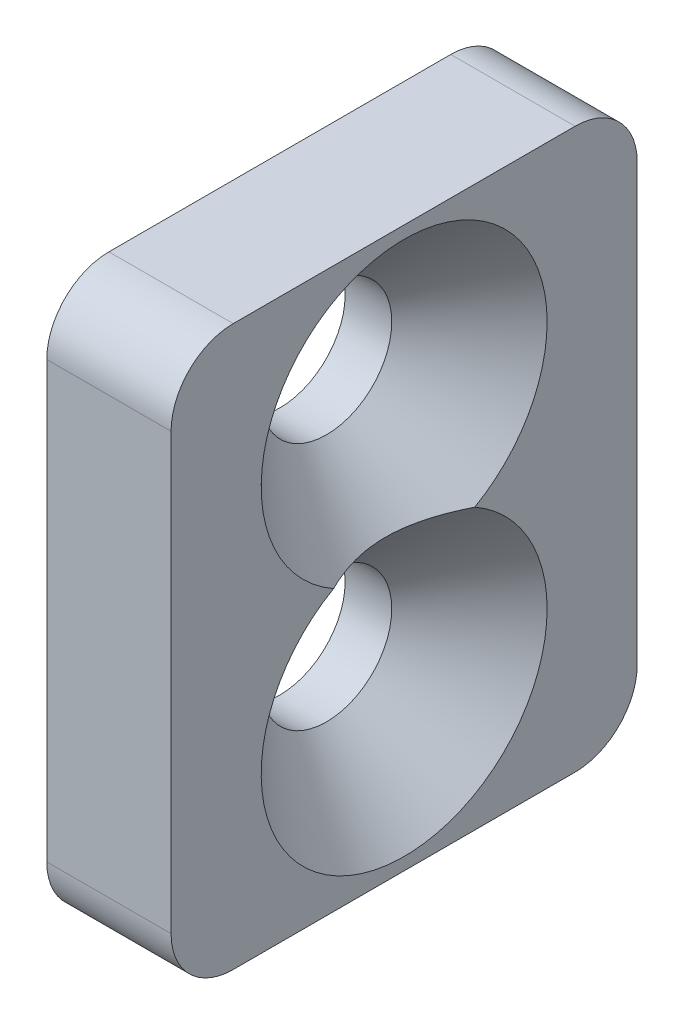
ISO-10303-21;
HEADER;
FILE_DESCRIPTION(('STEP AP214'),'2;1');
FILE_NAME('part.step','',(''),(''),'','','');
FILE_SCHEMA(('AUTOMOTIVE_DESIGN { 1 0 10303 214 1 1 1 1 }'));
ENDSEC;
DATA;
#1=APPLICATION_CONTEXT('core data for automotive mechanical design processes');
#2=APPLICATION_PROTOCOL_DEFINITION('international standard','automotive_design',2000,#1);
#3=PRODUCT_CONTEXT('',#1,'mechanical');
#4=PRODUCT('Part','Part','',(#3));
#5=PRODUCT_RELATED_PRODUCT_CATEGORY('part','',(#4));
#6=PRODUCT_DEFINITION_FORMATION('','',#4);
#7=PRODUCT_DEFINITION_CONTEXT('part definition',#1,'design');
#8=PRODUCT_DEFINITION('design','',#6,#7);
#9=PRODUCT_DEFINITION_SHAPE('','',#8);
#10=(LENGTH_UNIT() NAMED_UNIT(*) SI_UNIT(.MILLI.,.METRE.));
#11=(NAMED_UNIT(*) PLANE_ANGLE_UNIT() SI_UNIT($,.RADIAN.));
#12=(NAMED_UNIT(*) SI_UNIT($,.STERADIAN.) SOLID_ANGLE_UNIT());
#13=UNCERTAINTY_MEASURE_WITH_UNIT(LENGTH_MEASURE(1.E-05),#10,'distance_accuracy_value','');
#14=(GEOMETRIC_REPRESENTATION_CONTEXT(3) GLOBAL_UNCERTAINTY_ASSIGNED_CONTEXT((#13)) GLOBAL_UNIT_ASSIGNED_CONTEXT((#10,
#11,#12)) REPRESENTATION_CONTEXT('',''));
#15=CARTESIAN_POINT('',(0.,0.,0.));
#16=DIRECTION('',(0.,0.,1.));
#17=DIRECTION('',(1.,0.,0.));
#18=AXIS2_PLACEMENT_3D('',#15,#16,#17);
#19=CARTESIAN_POINT('',(4.,0.,0.));
#20=DIRECTION('',(-1.,0.,0.));
#21=DIRECTION('',(0.,0.,1.));
#22=AXIS2_PLACEMENT_3D('',#19,#20,#21);
#23=PLANE('',#22);
#24=CARTESIAN_POINT('',(4.,4.,0.));
#25=DIRECTION('',(-1.,0.,0.));
#26=DIRECTION('',(0.,0.,1.));
#27=AXIS2_PLACEMENT_3D('',#24,#25,#26);
#28=CIRCLE('',#27,4.60000000000001);
#29=CARTESIAN_POINT('',(4.,4.,-4.60000000000001));
#30=VERTEX_POINT('',#29);
#31=CARTESIAN_POINT('',(4.,0.,-2.27156333832013));
#32=VERTEX_POINT('',#31);
#33=EDGE_CURVE('E190',#30,#32,#28,.T.);
#34=ORIENTED_EDGE('',*,*,#33,.T.);
#35=CARTESIAN_POINT('',(4.,-4.,0.));
#36=DIRECTION('',(-1.,0.,0.));
#37=DIRECTION('',(0.,0.,1.));
#38=AXIS2_PLACEMENT_3D('',#35,#36,#37);
#39=CIRCLE('',#38,4.60000000000001);
#40=CARTESIAN_POINT('',(4.,-4.,-4.60000000000001));
#41=VERTEX_POINT('',#40);
#42=EDGE_CURVE('E49',#32,#41,#39,.T.);
#43=ORIENTED_EDGE('',*,*,#42,.T.);
#44=CARTESIAN_POINT('',(4.,-4.,0.));
#45=DIRECTION('',(-1.,0.,0.));
#46=DIRECTION('',(0.,0.,1.));
#47=AXIS2_PLACEMENT_3D('',#44,#45,#46);
#48=CIRCLE('',#47,4.60000000000001);
#49=CARTESIAN_POINT('',(4.,0.,2.27156333832013));
#50=VERTEX_POINT('',#49);
#51=EDGE_CURVE('E56',#41,#50,#48,.T.);
#52=ORIENTED_EDGE('',*,*,#51,.T.);
#53=CARTESIAN_POINT('',(4.,4.,0.));
#54=DIRECTION('',(-1.,0.,0.));
#55=DIRECTION('',(0.,0.,1.));
#56=AXIS2_PLACEMENT_3D('',#53,#54,#55);
#57=CIRCLE('',#56,4.60000000000001);
#58=EDGE_CURVE('E192',#50,#30,#57,.T.);
#59=ORIENTED_EDGE('',*,*,#58,.T.);
#60=EDGE_LOOP('',(#34,#43,#52,#59));
#61=FACE_BOUND('',#60,.T.);
#62=DIRECTION('',(0.,0.,-1.));
#63=VECTOR('',#62,1.);
#64=CARTESIAN_POINT('',(4.,-9.,7.5));
#65=LINE('',#64,#63);
#66=CARTESIAN_POINT('',(4.,-9.,5.5));
#67=VERTEX_POINT('',#66);
#68=CARTESIAN_POINT('',(4.,-9.,-5.5));
#69=VERTEX_POINT('',#68);
#70=EDGE_CURVE('E155',#67,#69,#65,.T.);
#71=ORIENTED_EDGE('',*,*,#70,.T.);
#72=CARTESIAN_POINT('',(4.,-7.,-5.5));
#73=DIRECTION('',(-1.,0.,0.));
#74=DIRECTION('',(0.,0.,1.));
#75=AXIS2_PLACEMENT_3D('',#72,#73,#74);
#76=CIRCLE('',#75,2.);
#77=CARTESIAN_POINT('',(4.,-7.,-7.5));
#78=VERTEX_POINT('',#77);
#79=EDGE_CURVE('E175',#69,#78,#76,.F.);
#80=ORIENTED_EDGE('',*,*,#79,.T.);
#81=DIRECTION('',(0.,1.,0.));
#82=VECTOR('',#81,1.);
#83=CARTESIAN_POINT('',(4.,-9.,-7.5));
#84=LINE('',#83,#82);
#85=CARTESIAN_POINT('',(4.,7.,-7.5));
#86=VERTEX_POINT('',#85);
#87=EDGE_CURVE('E137',#78,#86,#84,.T.);
#88=ORIENTED_EDGE('',*,*,#87,.T.);
#89=CARTESIAN_POINT('',(4.,7.,-5.5));
#90=DIRECTION('',(-1.,0.,0.));
#91=DIRECTION('',(0.,0.,1.));
#92=AXIS2_PLACEMENT_3D('',#89,#90,#91);
#93=CIRCLE('',#92,2.);
#94=CARTESIAN_POINT('',(4.,9.,-5.5));
#95=VERTEX_POINT('',#94);
#96=EDGE_CURVE('E171',#86,#95,#93,.F.);
#97=ORIENTED_EDGE('',*,*,#96,.T.);
#98=DIRECTION('',(0.,0.,1.));
#99=VECTOR('',#98,1.);
#100=CARTESIAN_POINT('',(4.,9.,7.5));
#101=LINE('',#100,#99);
#102=CARTESIAN_POINT('',(4.,9.,5.5));
#103=VERTEX_POINT('',#102);
#104=EDGE_CURVE('E205',#95,#103,#101,.T.);
#105=ORIENTED_EDGE('',*,*,#104,.T.);
#106=CARTESIAN_POINT('',(4.,7.,5.5));
#107=DIRECTION('',(-1.,0.,0.));
#108=DIRECTION('',(0.,0.,1.));
#109=AXIS2_PLACEMENT_3D('',#106,#107,#108);
#110=CIRCLE('',#109,2.);
#111=CARTESIAN_POINT('',(4.,7.,7.5));
#112=VERTEX_POINT('',#111);
#113=EDGE_CURVE('E169',#103,#112,#110,.F.);
#114=ORIENTED_EDGE('',*,*,#113,.T.);
#115=DIRECTION('',(0.,-1.,0.));
#116=VECTOR('',#115,1.);
#117=CARTESIAN_POINT('',(4.,-9.,7.5));
#118=LINE('',#117,#116);
#119=CARTESIAN_POINT('',(4.,-7.,7.5));
#120=VERTEX_POINT('',#119);
#121=EDGE_CURVE('E207',#112,#120,#118,.T.);
#122=ORIENTED_EDGE('',*,*,#121,.T.);
#123=CARTESIAN_POINT('',(4.,-7.,5.5));
#124=DIRECTION('',(-1.,0.,0.));
#125=DIRECTION('',(0.,0.,1.));
#126=AXIS2_PLACEMENT_3D('',#123,#124,#125);
#127=CIRCLE('',#126,2.);
#128=EDGE_CURVE('E173',#120,#67,#127,.F.);
#129=ORIENTED_EDGE('',*,*,#128,.T.);
#130=EDGE_LOOP('',(#71,#80,#88,#97,#105,#114,#122,#129));
#131=FACE_BOUND('',#130,.T.);
#132=ADVANCED_FACE('F34',(#61,#131),#23,.F.);
#133=CARTESIAN_POINT('',(0.,0.,0.));
#134=DIRECTION('',(-1.,0.,0.));
#135=DIRECTION('',(0.,0.,1.));
#136=AXIS2_PLACEMENT_3D('',#133,#134,#135);
#137=PLANE('',#136);
#138=CARTESIAN_POINT('',(0.,4.,0.));
#139=DIRECTION('',(1.,0.,0.));
#140=DIRECTION('',(0.,0.,-1.));
#141=AXIS2_PLACEMENT_3D('',#138,#139,#140);
#142=CIRCLE('',#141,2.1);
#143=CARTESIAN_POINT('',(0.,4.,-2.1));
#144=VERTEX_POINT('',#143);
#145=EDGE_CURVE('E146',#144,#144,#142,.T.);
#146=ORIENTED_EDGE('',*,*,#145,.T.);
#147=EDGE_LOOP('',(#146));
#148=FACE_BOUND('',#147,.T.);
#149=DIRECTION('',(0.,1.,0.));
#150=VECTOR('',#149,1.);
#151=CARTESIAN_POINT('',(0.,-9.,-7.5));
#152=LINE('',#151,#150);
#153=CARTESIAN_POINT('',(0.,-7.,-7.5));
#154=VERTEX_POINT('',#153);
#155=CARTESIAN_POINT('',(0.,7.,-7.5));
#156=VERTEX_POINT('',#155);
#157=EDGE_CURVE('E134',#154,#156,#152,.T.);
#158=ORIENTED_EDGE('',*,*,#157,.F.);
#159=CARTESIAN_POINT('',(0.,-7.,-5.5));
#160=DIRECTION('',(-1.,0.,0.));
#161=DIRECTION('',(0.,0.,1.));
#162=AXIS2_PLACEMENT_3D('',#159,#160,#161);
#163=CIRCLE('',#162,2.);
#164=CARTESIAN_POINT('',(0.,-9.,-5.5));
#165=VERTEX_POINT('',#164);
#166=EDGE_CURVE('E117',#154,#165,#163,.T.);
#167=ORIENTED_EDGE('',*,*,#166,.T.);
#168=DIRECTION('',(0.,0.,-1.));
#169=VECTOR('',#168,1.);
#170=CARTESIAN_POINT('',(0.,-9.,7.5));
#171=LINE('',#170,#169);
#172=CARTESIAN_POINT('',(0.,-9.,5.5));
#173=VERTEX_POINT('',#172);
#174=EDGE_CURVE('E160',#173,#165,#171,.T.);
#175=ORIENTED_EDGE('',*,*,#174,.F.);
#176=CARTESIAN_POINT('',(0.,-7.,5.5));
#177=DIRECTION('',(-1.,0.,0.));
#178=DIRECTION('',(0.,0.,1.));
#179=AXIS2_PLACEMENT_3D('',#176,#177,#178);
#180=CIRCLE('',#179,2.);
#181=CARTESIAN_POINT('',(0.,-7.,7.5));
#182=VERTEX_POINT('',#181);
#183=EDGE_CURVE('E128',#173,#182,#180,.T.);
#184=ORIENTED_EDGE('',*,*,#183,.T.);
#185=DIRECTION('',(0.,-1.,0.));
#186=VECTOR('',#185,1.);
#187=CARTESIAN_POINT('',(0.,-9.,7.5));
#188=LINE('',#187,#186);
#189=CARTESIAN_POINT('',(0.,7.,7.5));
#190=VERTEX_POINT('',#189);
#191=EDGE_CURVE('E149',#190,#182,#188,.T.);
#192=ORIENTED_EDGE('',*,*,#191,.F.);
#193=CARTESIAN_POINT('',(0.,7.,5.5));
#194=DIRECTION('',(-1.,0.,0.));
#195=DIRECTION('',(0.,0.,1.));
#196=AXIS2_PLACEMENT_3D('',#193,#194,#195);
#197=CIRCLE('',#196,2.);
#198=CARTESIAN_POINT('',(0.,9.,5.5));
#199=VERTEX_POINT('',#198);
#200=EDGE_CURVE('E138',#190,#199,#197,.T.);
#201=ORIENTED_EDGE('',*,*,#200,.T.);
#202=DIRECTION('',(0.,0.,1.));
#203=VECTOR('',#202,1.);
#204=CARTESIAN_POINT('',(0.,9.,7.5));
#205=LINE('',#204,#203);
#206=CARTESIAN_POINT('',(0.,9.,-5.5));
#207=VERTEX_POINT('',#206);
#208=EDGE_CURVE('E145',#207,#199,#205,.T.);
#209=ORIENTED_EDGE('',*,*,#208,.F.);
#210=CARTESIAN_POINT('',(0.,7.,-5.5));
#211=DIRECTION('',(-1.,0.,0.));
#212=DIRECTION('',(0.,0.,1.));
#213=AXIS2_PLACEMENT_3D('',#210,#211,#212);
#214=CIRCLE('',#213,2.);
#215=EDGE_CURVE('E144',#207,#156,#214,.T.);
#216=ORIENTED_EDGE('',*,*,#215,.T.);
#217=EDGE_LOOP('',(#158,#167,#175,#184,#192,#201,#209,#216));
#218=FACE_BOUND('',#217,.T.);
#219=CARTESIAN_POINT('',(0.,-4.,0.));
#220=DIRECTION('',(1.,0.,0.));
#221=DIRECTION('',(0.,0.,-1.));
#222=AXIS2_PLACEMENT_3D('',#219,#220,#221);
#223=CIRCLE('',#222,2.1);
#224=CARTESIAN_POINT('',(0.,-4.,-2.1));
#225=VERTEX_POINT('',#224);
#226=EDGE_CURVE('E152',#225,#225,#223,.T.);
#227=ORIENTED_EDGE('',*,*,#226,.T.);
#228=EDGE_LOOP('',(#227));
#229=FACE_BOUND('',#228,.T.);
#230=ADVANCED_FACE('F141',(#148,#218,#229),#137,.T.);
#231=CARTESIAN_POINT('',(4.,-9.,-7.5));
#232=DIRECTION('',(0.,0.,1.));
#233=DIRECTION('',(1.,0.,0.));
#234=AXIS2_PLACEMENT_3D('',#231,#232,#233);
#235=PLANE('',#234);
#236=ORIENTED_EDGE('',*,*,#87,.F.);
#237=DIRECTION('',(-1.,0.,0.));
#238=VECTOR('',#237,1.);
#239=CARTESIAN_POINT('',(4.,-7.,-7.5));
#240=LINE('',#239,#238);
#241=EDGE_CURVE('E121',#78,#154,#240,.T.);
#242=ORIENTED_EDGE('',*,*,#241,.T.);
#243=ORIENTED_EDGE('',*,*,#157,.T.);
#244=DIRECTION('',(-1.,0.,0.));
#245=VECTOR('',#244,1.);
#246=CARTESIAN_POINT('',(4.,7.,-7.5));
#247=LINE('',#246,#245);
#248=EDGE_CURVE('E139',#156,#86,#247,.F.);
#249=ORIENTED_EDGE('',*,*,#248,.T.);
#250=EDGE_LOOP('',(#236,#242,#243,#249));
#251=FACE_BOUND('',#250,.T.);
#252=ADVANCED_FACE('F133',(#251),#235,.F.);
#253=CARTESIAN_POINT('',(4.,9.,7.5));
#254=DIRECTION('',(0.,-1.,0.));
#255=DIRECTION('',(0.,0.,-1.));
#256=AXIS2_PLACEMENT_3D('',#253,#254,#255);
#257=PLANE('',#256);
#258=ORIENTED_EDGE('',*,*,#104,.F.);
#259=DIRECTION('',(-1.,0.,0.));
#260=VECTOR('',#259,1.);
#261=CARTESIAN_POINT('',(4.,9.,-5.5));
#262=LINE('',#261,#260);
#263=EDGE_CURVE('E184',#95,#207,#262,.T.);
#264=ORIENTED_EDGE('',*,*,#263,.T.);
#265=ORIENTED_EDGE('',*,*,#208,.T.);
#266=DIRECTION('',(-1.,0.,0.));
#267=VECTOR('',#266,1.);
#268=CARTESIAN_POINT('',(4.,9.,5.5));
#269=LINE('',#268,#267);
#270=EDGE_CURVE('E182',#199,#103,#269,.F.);
#271=ORIENTED_EDGE('',*,*,#270,.T.);
#272=EDGE_LOOP('',(#258,#264,#265,#271));
#273=FACE_BOUND('',#272,.T.);
#274=ADVANCED_FACE('F229',(#273),#257,.F.);
#275=CARTESIAN_POINT('',(4.,-9.,7.5));
#276=DIRECTION('',(0.,0.,-1.));
#277=DIRECTION('',(-1.,0.,0.));
#278=AXIS2_PLACEMENT_3D('',#275,#276,#277);
#279=PLANE('',#278);
#280=ORIENTED_EDGE('',*,*,#191,.T.);
#281=DIRECTION('',(-1.,0.,0.));
#282=VECTOR('',#281,1.);
#283=CARTESIAN_POINT('',(4.,-7.,7.5));
#284=LINE('',#283,#282);
#285=EDGE_CURVE('E180',#182,#120,#284,.F.);
#286=ORIENTED_EDGE('',*,*,#285,.T.);
#287=ORIENTED_EDGE('',*,*,#121,.F.);
#288=DIRECTION('',(-1.,0.,0.));
#289=VECTOR('',#288,1.);
#290=CARTESIAN_POINT('',(4.,7.,7.5));
#291=LINE('',#290,#289);
#292=EDGE_CURVE('E177',#112,#190,#291,.T.);
#293=ORIENTED_EDGE('',*,*,#292,.T.);
#294=EDGE_LOOP('',(#280,#286,#287,#293));
#295=FACE_BOUND('',#294,.T.);
#296=ADVANCED_FACE('F221',(#295),#279,.F.);
#297=CARTESIAN_POINT('',(4.,-9.,7.5));
#298=DIRECTION('',(0.,1.,0.));
#299=DIRECTION('',(0.,0.,1.));
#300=AXIS2_PLACEMENT_3D('',#297,#298,#299);
#301=PLANE('',#300);
#302=ORIENTED_EDGE('',*,*,#174,.T.);
#303=DIRECTION('',(-1.,0.,0.));
#304=VECTOR('',#303,1.);
#305=CARTESIAN_POINT('',(4.,-9.,-5.5));
#306=LINE('',#305,#304);
#307=EDGE_CURVE('E122',#165,#69,#306,.F.);
#308=ORIENTED_EDGE('',*,*,#307,.T.);
#309=ORIENTED_EDGE('',*,*,#70,.F.);
#310=DIRECTION('',(-1.,0.,0.));
#311=VECTOR('',#310,1.);
#312=CARTESIAN_POINT('',(4.,-9.,5.5));
#313=LINE('',#312,#311);
#314=EDGE_CURVE('E127',#67,#173,#313,.T.);
#315=ORIENTED_EDGE('',*,*,#314,.T.);
#316=EDGE_LOOP('',(#302,#308,#309,#315));
#317=FACE_BOUND('',#316,.T.);
#318=ADVANCED_FACE('F215',(#317),#301,.F.);
#319=CARTESIAN_POINT('',(4.,4.,0.));
#320=DIRECTION('',(-1.,0.,0.));
#321=DIRECTION('',(0.,0.,1.));
#322=AXIS2_PLACEMENT_3D('',#319,#320,#321);
#323=CYLINDRICAL_SURFACE('',#322,2.1);
#324=CARTESIAN_POINT('',(1.5,4.,0.));
#325=DIRECTION('',(-1.,0.,0.));
#326=DIRECTION('',(0.,0.,1.));
#327=AXIS2_PLACEMENT_3D('',#324,#325,#326);
#328=CIRCLE('',#327,2.1);
#329=CARTESIAN_POINT('',(1.5,4.,2.1));
#330=VERTEX_POINT('',#329);
#331=EDGE_CURVE('E11',#330,#330,#328,.F.);
#332=ORIENTED_EDGE('',*,*,#331,.T.);
#333=EDGE_LOOP('',(#332));
#334=FACE_BOUND('',#333,.T.);
#335=ORIENTED_EDGE('',*,*,#145,.F.);
#336=EDGE_LOOP('',(#335));
#337=FACE_BOUND('',#336,.T.);
#338=ADVANCED_FACE('F251',(#334,#337),#323,.F.);
#339=CARTESIAN_POINT('',(4.,-4.,0.));
#340=DIRECTION('',(-1.,0.,0.));
#341=DIRECTION('',(0.,0.,1.));
#342=AXIS2_PLACEMENT_3D('',#339,#340,#341);
#343=CYLINDRICAL_SURFACE('',#342,2.1);
#344=CARTESIAN_POINT('',(1.5,-4.,0.));
#345=DIRECTION('',(-1.,0.,0.));
#346=DIRECTION('',(0.,0.,1.));
#347=AXIS2_PLACEMENT_3D('',#344,#345,#346);
#348=CIRCLE('',#347,2.1);
#349=CARTESIAN_POINT('',(1.5,-4.,2.1));
#350=VERTEX_POINT('',#349);
#351=EDGE_CURVE('E187',#350,#350,#348,.F.);
#352=ORIENTED_EDGE('',*,*,#351,.T.);
#353=EDGE_LOOP('',(#352));
#354=FACE_BOUND('',#353,.T.);
#355=ORIENTED_EDGE('',*,*,#226,.F.);
#356=EDGE_LOOP('',(#355));
#357=FACE_BOUND('',#356,.T.);
#358=ADVANCED_FACE('F263',(#354,#357),#343,.F.);
#359=CARTESIAN_POINT('',(4.,-7.,-5.5));
#360=DIRECTION('',(-1.,0.,0.));
#361=DIRECTION('',(0.,0.,1.));
#362=AXIS2_PLACEMENT_3D('',#359,#360,#361);
#363=CYLINDRICAL_SURFACE('',#362,2.);
#364=ORIENTED_EDGE('',*,*,#79,.F.);
#365=ORIENTED_EDGE('',*,*,#307,.F.);
#366=ORIENTED_EDGE('',*,*,#166,.F.);
#367=ORIENTED_EDGE('',*,*,#241,.F.);
#368=EDGE_LOOP('',(#364,#365,#366,#367));
#369=FACE_BOUND('',#368,.T.);
#370=ADVANCED_FACE('F120',(#369),#363,.T.);
#371=CARTESIAN_POINT('',(4.,-7.,5.5));
#372=DIRECTION('',(-1.,0.,0.));
#373=DIRECTION('',(0.,0.,1.));
#374=AXIS2_PLACEMENT_3D('',#371,#372,#373);
#375=CYLINDRICAL_SURFACE('',#374,2.);
#376=ORIENTED_EDGE('',*,*,#128,.F.);
#377=ORIENTED_EDGE('',*,*,#285,.F.);
#378=ORIENTED_EDGE('',*,*,#183,.F.);
#379=ORIENTED_EDGE('',*,*,#314,.F.);
#380=EDGE_LOOP('',(#376,#377,#378,#379));
#381=FACE_BOUND('',#380,.T.);
#382=ADVANCED_FACE('F217',(#381),#375,.T.);
#383=CARTESIAN_POINT('',(4.,7.,-5.5));
#384=DIRECTION('',(-1.,0.,0.));
#385=DIRECTION('',(0.,0.,1.));
#386=AXIS2_PLACEMENT_3D('',#383,#384,#385);
#387=CYLINDRICAL_SURFACE('',#386,2.);
#388=ORIENTED_EDGE('',*,*,#96,.F.);
#389=ORIENTED_EDGE('',*,*,#248,.F.);
#390=ORIENTED_EDGE('',*,*,#215,.F.);
#391=ORIENTED_EDGE('',*,*,#263,.F.);
#392=EDGE_LOOP('',(#388,#389,#390,#391));
#393=FACE_BOUND('',#392,.T.);
#394=ADVANCED_FACE('F233',(#393),#387,.T.);
#395=CARTESIAN_POINT('',(4.,7.,5.5));
#396=DIRECTION('',(-1.,0.,0.));
#397=DIRECTION('',(0.,0.,1.));
#398=AXIS2_PLACEMENT_3D('',#395,#396,#397);
#399=CYLINDRICAL_SURFACE('',#398,2.);
#400=ORIENTED_EDGE('',*,*,#113,.F.);
#401=ORIENTED_EDGE('',*,*,#270,.F.);
#402=ORIENTED_EDGE('',*,*,#200,.F.);
#403=ORIENTED_EDGE('',*,*,#292,.F.);
#404=EDGE_LOOP('',(#400,#401,#402,#403));
#405=FACE_BOUND('',#404,.T.);
#406=ADVANCED_FACE('F225',(#405),#399,.T.);
#407=CARTESIAN_POINT('',(1.5,4.,0.));
#408=DIRECTION('',(1.,0.,0.));
#409=DIRECTION('',(0.,0.,-1.));
#410=AXIS2_PLACEMENT_3D('',#407,#408,#409);
#411=CONICAL_SURFACE('',#410,2.1,0.78539816339745);
#412=ORIENTED_EDGE('',*,*,#331,.F.);
#413=EDGE_LOOP('',(#412));
#414=FACE_BOUND('',#413,.T.);
#415=CARTESIAN_POINT('',(4.00020000000011,0.,-2.27196831844132));
#416=CARTESIAN_POINT('',(3.92296050682109,0.,-2.11544154844825));
#417=CARTESIAN_POINT('',(3.85034532167528,0.,-1.95632028580841));
#418=CARTESIAN_POINT('',(3.71754679053139,0.,-1.63198494932717));
#419=CARTESIAN_POINT('',(3.65743472866542,0.,-1.46674194515001));
#420=CARTESIAN_POINT('',(3.55455551734232,0.,-1.13356352252316));
#421=CARTESIAN_POINT('',(3.51153730069734,0.,-0.965707860682925));
#422=CARTESIAN_POINT('',(3.4453518805799,0.,-0.626410785872026));
#423=CARTESIAN_POINT('',(3.42213732844844,0.,-0.454978935273291));
#424=CARTESIAN_POINT('',(3.40115210654703,0.,-0.15766388554166));
#425=CARTESIAN_POINT('',(3.39816202212132,0.,-0.0321353329715648));
#426=CARTESIAN_POINT('',(3.40401297967577,0.,0.218695641848236));
#427=CARTESIAN_POINT('',(3.41285809023779,0.,0.343997971498914));
#428=CARTESIAN_POINT('',(3.44187338787776,0.,0.593391616554975));
#429=CARTESIAN_POINT('',(3.46205551059557,0.,0.717481515198151));
#430=CARTESIAN_POINT('',(3.51264755047551,0.,0.96352120210713));
#431=CARTESIAN_POINT('',(3.54305664503286,0.,1.08547116166875));
#432=CARTESIAN_POINT('',(3.60446590348649,0.,1.29819711677659));
#433=CARTESIAN_POINT('',(3.63362077605988,0.,1.38951657337397));
#434=CARTESIAN_POINT('',(3.69645383656937,0.,1.57058019826594));
#435=CARTESIAN_POINT('',(3.73013196740192,0.,1.66032438643122));
#436=CARTESIAN_POINT('',(3.80130068987547,0.,1.83794893963599));
#437=CARTESIAN_POINT('',(3.8387789930279,0.,1.92583426748987));
#438=CARTESIAN_POINT('',(3.91709623586857,0.,2.10004466020927));
#439=CARTESIAN_POINT('',(3.9579334657825,0.,2.18637049193462));
#440=CARTESIAN_POINT('',(4.0002,0.,2.2719683184411));
#441=B_SPLINE_CURVE_WITH_KNOTS('',3,(#415,#416,#417,#418,#419,#420,#421,#422,#423,#424,#425,
#426,#427,#428,#429,#430,#431,#432,#433,#434,#435,#436,#437,#438,#439,#440),.UNSPECIFIED.,.F.,
.F.,(4,2,2,2,2,2,2,2,2,2,2,2,4),(0.,0.523989662894732,1.05088947504113,1.56973581871381,
2.0873381457703,2.463497465467,2.83978613058148,3.21647169799834,3.59312697401732,
3.88058628034726,4.16804195800801,4.45459607435868,4.74100521992246),.UNSPECIFIED.);
#442=EDGE_CURVE('E39',#32,#50,#441,.T.);
#443=ORIENTED_EDGE('',*,*,#442,.F.);
#444=ORIENTED_EDGE('',*,*,#33,.F.);
#445=ORIENTED_EDGE('',*,*,#58,.F.);
#446=EDGE_LOOP('',(#443,#444,#445));
#447=FACE_BOUND('',#446,.T.);
#448=ADVANCED_FACE('F240',(#414,#447),#411,.F.);
#449=CARTESIAN_POINT('',(1.5,-4.,0.));
#450=DIRECTION('',(1.,0.,0.));
#451=DIRECTION('',(0.,0.,-1.));
#452=AXIS2_PLACEMENT_3D('',#449,#450,#451);
#453=CONICAL_SURFACE('',#452,2.1,0.78539816339745);
#454=ORIENTED_EDGE('',*,*,#42,.F.);
#455=ORIENTED_EDGE('',*,*,#442,.T.);
#456=ORIENTED_EDGE('',*,*,#51,.F.);
#457=EDGE_LOOP('',(#454,#455,#456));
#458=FACE_BOUND('',#457,.T.);
#459=ORIENTED_EDGE('',*,*,#351,.F.);
#460=EDGE_LOOP('',(#459));
#461=FACE_BOUND('',#460,.T.);
#462=ADVANCED_FACE('F37',(#458,#461),#453,.F.);
#463=CLOSED_SHELL('',(#132,#230,#252,#274,#296,#318,#338,#358,#370,#382,#394,#406,#448,#462));
#464=MANIFOLD_SOLID_BREP('B2',#463);
#465=ADVANCED_BREP_SHAPE_REPRESENTATION('',(#18,#464),#14);
#466=SHAPE_DEFINITION_REPRESENTATION(#9,#465);
ENDSEC;
END-ISO-10303-21;
